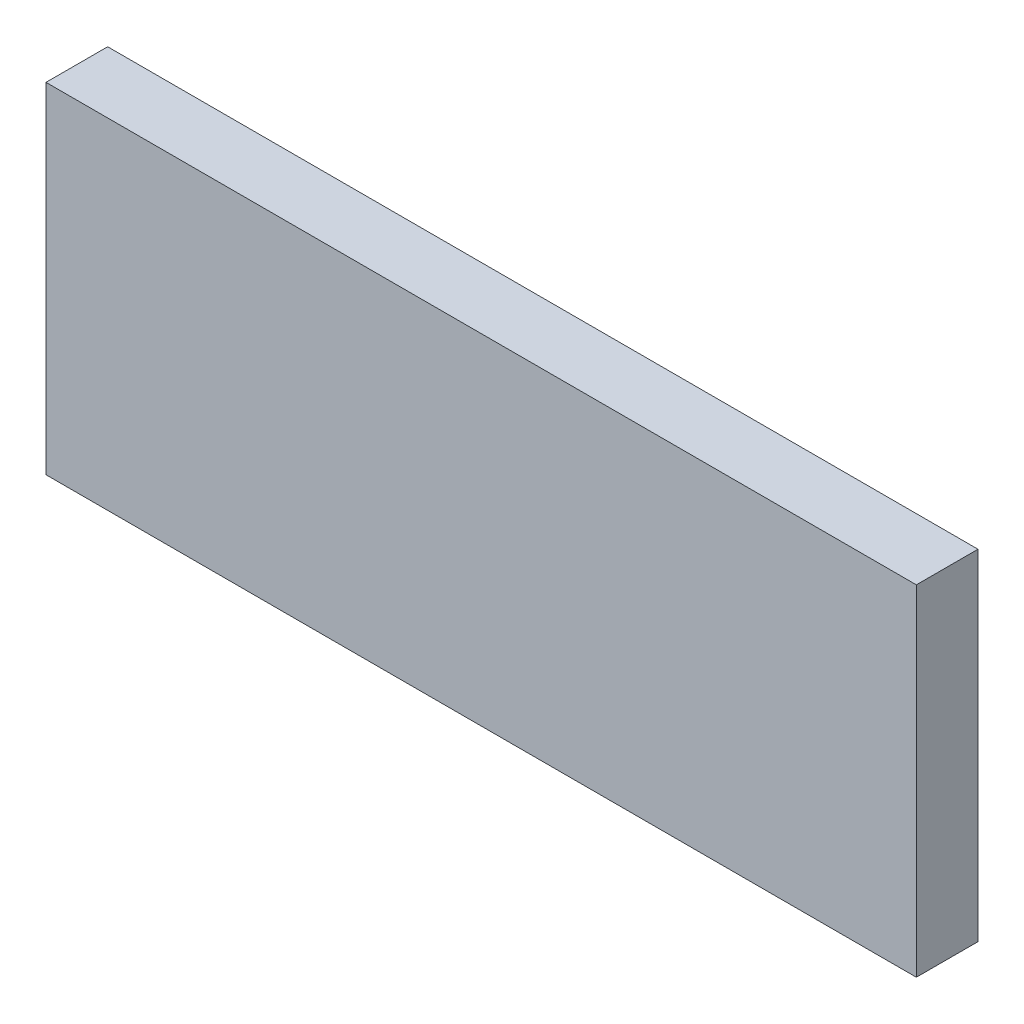
ISO-10303-21;
HEADER;
FILE_DESCRIPTION(('STEP AP214'),'2;1');
FILE_NAME('part.step','',(''),(''),'','','');
FILE_SCHEMA(('AUTOMOTIVE_DESIGN { 1 0 10303 214 1 1 1 1 }'));
ENDSEC;
DATA;
#1=APPLICATION_CONTEXT('core data for automotive mechanical design processes');
#2=APPLICATION_PROTOCOL_DEFINITION('international standard','automotive_design',2000,#1);
#3=PRODUCT_CONTEXT('',#1,'mechanical');
#4=PRODUCT('Part','Part','',(#3));
#5=PRODUCT_RELATED_PRODUCT_CATEGORY('part','',(#4));
#6=PRODUCT_DEFINITION_FORMATION('','',#4);
#7=PRODUCT_DEFINITION_CONTEXT('part definition',#1,'design');
#8=PRODUCT_DEFINITION('design','',#6,#7);
#9=PRODUCT_DEFINITION_SHAPE('','',#8);
#10=(LENGTH_UNIT() NAMED_UNIT(*) SI_UNIT(.MILLI.,.METRE.));
#11=(NAMED_UNIT(*) PLANE_ANGLE_UNIT() SI_UNIT($,.RADIAN.));
#12=(NAMED_UNIT(*) SI_UNIT($,.STERADIAN.) SOLID_ANGLE_UNIT());
#13=UNCERTAINTY_MEASURE_WITH_UNIT(LENGTH_MEASURE(1.E-05),#10,'distance_accuracy_value','');
#14=(GEOMETRIC_REPRESENTATION_CONTEXT(3) GLOBAL_UNCERTAINTY_ASSIGNED_CONTEXT((#13)) GLOBAL_UNIT_ASSIGNED_CONTEXT((#10,
#11,#12)) REPRESENTATION_CONTEXT('',''));
#15=CARTESIAN_POINT('',(0.,0.,0.));
#16=DIRECTION('',(0.,0.,1.));
#17=DIRECTION('',(1.,0.,0.));
#18=AXIS2_PLACEMENT_3D('',#15,#16,#17);
#19=CARTESIAN_POINT('',(44.815,-17.5,6.35));
#20=DIRECTION('',(-1.,0.,0.));
#21=DIRECTION('',(0.,0.,1.));
#22=AXIS2_PLACEMENT_3D('',#19,#20,#21);
#23=PLANE('',#22);
#24=DIRECTION('',(0.,1.,0.));
#25=VECTOR('',#24,1.);
#26=CARTESIAN_POINT('',(44.815,-17.5,0.));
#27=LINE('',#26,#25);
#28=CARTESIAN_POINT('',(44.815,-17.5,0.));
#29=VERTEX_POINT('',#28);
#30=CARTESIAN_POINT('',(44.815,17.5,0.));
#31=VERTEX_POINT('',#30);
#32=EDGE_CURVE('E111',#29,#31,#27,.T.);
#33=ORIENTED_EDGE('',*,*,#32,.T.);
#34=DIRECTION('',(0.,0.,-1.));
#35=VECTOR('',#34,1.);
#36=CARTESIAN_POINT('',(44.815,17.5,6.35));
#37=LINE('',#36,#35);
#38=CARTESIAN_POINT('',(44.815,17.5,6.35));
#39=VERTEX_POINT('',#38);
#40=EDGE_CURVE('E11',#39,#31,#37,.T.);
#41=ORIENTED_EDGE('',*,*,#40,.F.);
#42=DIRECTION('',(0.,1.,0.));
#43=VECTOR('',#42,1.);
#44=CARTESIAN_POINT('',(44.815,-17.5,6.35));
#45=LINE('',#44,#43);
#46=CARTESIAN_POINT('',(44.815,-17.5,6.35));
#47=VERTEX_POINT('',#46);
#48=EDGE_CURVE('E95',#47,#39,#45,.T.);
#49=ORIENTED_EDGE('',*,*,#48,.F.);
#50=DIRECTION('',(0.,0.,-1.));
#51=VECTOR('',#50,1.);
#52=CARTESIAN_POINT('',(44.815,-17.5,6.35));
#53=LINE('',#52,#51);
#54=EDGE_CURVE('E107',#47,#29,#53,.T.);
#55=ORIENTED_EDGE('',*,*,#54,.T.);
#56=EDGE_LOOP('',(#33,#41,#49,#55));
#57=FACE_BOUND('',#56,.T.);
#58=ADVANCED_FACE('F43',(#57),#23,.F.);
#59=CARTESIAN_POINT('',(-44.815,17.5,6.35));
#60=DIRECTION('',(0.,-1.,0.));
#61=DIRECTION('',(0.,0.,-1.));
#62=AXIS2_PLACEMENT_3D('',#59,#60,#61);
#63=PLANE('',#62);
#64=DIRECTION('',(-1.,0.,0.));
#65=VECTOR('',#64,1.);
#66=CARTESIAN_POINT('',(-44.815,17.5,0.));
#67=LINE('',#66,#65);
#68=CARTESIAN_POINT('',(-44.815,17.5,0.));
#69=VERTEX_POINT('',#68);
#70=EDGE_CURVE('E100',#31,#69,#67,.T.);
#71=ORIENTED_EDGE('',*,*,#70,.T.);
#72=DIRECTION('',(0.,0.,-1.));
#73=VECTOR('',#72,1.);
#74=CARTESIAN_POINT('',(-44.815,17.5,6.35));
#75=LINE('',#74,#73);
#76=CARTESIAN_POINT('',(-44.815,17.5,6.35));
#77=VERTEX_POINT('',#76);
#78=EDGE_CURVE('E52',#77,#69,#75,.T.);
#79=ORIENTED_EDGE('',*,*,#78,.F.);
#80=DIRECTION('',(-1.,0.,0.));
#81=VECTOR('',#80,1.);
#82=CARTESIAN_POINT('',(-44.815,17.5,6.35));
#83=LINE('',#82,#81);
#84=EDGE_CURVE('E90',#39,#77,#83,.T.);
#85=ORIENTED_EDGE('',*,*,#84,.F.);
#86=ORIENTED_EDGE('',*,*,#40,.T.);
#87=EDGE_LOOP('',(#71,#79,#85,#86));
#88=FACE_BOUND('',#87,.T.);
#89=ADVANCED_FACE('F99',(#88),#63,.F.);
#90=CARTESIAN_POINT('',(-44.815,-17.5,6.35));
#91=DIRECTION('',(1.,0.,0.));
#92=DIRECTION('',(0.,0.,-1.));
#93=AXIS2_PLACEMENT_3D('',#90,#91,#92);
#94=PLANE('',#93);
#95=DIRECTION('',(0.,-1.,0.));
#96=VECTOR('',#95,1.);
#97=CARTESIAN_POINT('',(-44.815,-17.5,0.));
#98=LINE('',#97,#96);
#99=CARTESIAN_POINT('',(-44.815,-17.5,0.));
#100=VERTEX_POINT('',#99);
#101=EDGE_CURVE('E77',#69,#100,#98,.T.);
#102=ORIENTED_EDGE('',*,*,#101,.T.);
#103=DIRECTION('',(0.,0.,-1.));
#104=VECTOR('',#103,1.);
#105=CARTESIAN_POINT('',(-44.815,-17.5,6.35));
#106=LINE('',#105,#104);
#107=CARTESIAN_POINT('',(-44.815,-17.5,6.35));
#108=VERTEX_POINT('',#107);
#109=EDGE_CURVE('E102',#108,#100,#106,.T.);
#110=ORIENTED_EDGE('',*,*,#109,.F.);
#111=DIRECTION('',(0.,-1.,0.));
#112=VECTOR('',#111,1.);
#113=CARTESIAN_POINT('',(-44.815,-17.5,6.35));
#114=LINE('',#113,#112);
#115=EDGE_CURVE('E93',#77,#108,#114,.T.);
#116=ORIENTED_EDGE('',*,*,#115,.F.);
#117=ORIENTED_EDGE('',*,*,#78,.T.);
#118=EDGE_LOOP('',(#102,#110,#116,#117));
#119=FACE_BOUND('',#118,.T.);
#120=ADVANCED_FACE('F103',(#119),#94,.F.);
#121=CARTESIAN_POINT('',(-44.815,-17.5,6.35));
#122=DIRECTION('',(0.,1.,0.));
#123=DIRECTION('',(0.,0.,1.));
#124=AXIS2_PLACEMENT_3D('',#121,#122,#123);
#125=PLANE('',#124);
#126=DIRECTION('',(1.,0.,0.));
#127=VECTOR('',#126,1.);
#128=CARTESIAN_POINT('',(-44.815,-17.5,0.));
#129=LINE('',#128,#127);
#130=EDGE_CURVE('E83',#100,#29,#129,.T.);
#131=ORIENTED_EDGE('',*,*,#130,.T.);
#132=ORIENTED_EDGE('',*,*,#54,.F.);
#133=DIRECTION('',(1.,0.,0.));
#134=VECTOR('',#133,1.);
#135=CARTESIAN_POINT('',(-44.815,-17.5,6.35));
#136=LINE('',#135,#134);
#137=EDGE_CURVE('E60',#108,#47,#136,.T.);
#138=ORIENTED_EDGE('',*,*,#137,.F.);
#139=ORIENTED_EDGE('',*,*,#109,.T.);
#140=EDGE_LOOP('',(#131,#132,#138,#139));
#141=FACE_BOUND('',#140,.T.);
#142=ADVANCED_FACE('F124',(#141),#125,.F.);
#143=CARTESIAN_POINT('',(0.,0.,6.35));
#144=DIRECTION('',(0.,0.,-1.));
#145=DIRECTION('',(-1.,0.,0.));
#146=AXIS2_PLACEMENT_3D('',#143,#144,#145);
#147=PLANE('',#146);
#148=ORIENTED_EDGE('',*,*,#48,.T.);
#149=ORIENTED_EDGE('',*,*,#84,.T.);
#150=ORIENTED_EDGE('',*,*,#115,.T.);
#151=ORIENTED_EDGE('',*,*,#137,.T.);
#152=EDGE_LOOP('',(#148,#149,#150,#151));
#153=FACE_BOUND('',#152,.T.);
#154=ADVANCED_FACE('F91',(#153),#147,.F.);
#155=CARTESIAN_POINT('',(0.,0.,0.));
#156=DIRECTION('',(0.,0.,-1.));
#157=DIRECTION('',(-1.,0.,0.));
#158=AXIS2_PLACEMENT_3D('',#155,#156,#157);
#159=PLANE('',#158);
#160=ORIENTED_EDGE('',*,*,#32,.F.);
#161=ORIENTED_EDGE('',*,*,#130,.F.);
#162=ORIENTED_EDGE('',*,*,#101,.F.);
#163=ORIENTED_EDGE('',*,*,#70,.F.);
#164=EDGE_LOOP('',(#160,#161,#162,#163));
#165=FACE_BOUND('',#164,.T.);
#166=ADVANCED_FACE('F127',(#165),#159,.T.);
#167=CLOSED_SHELL('',(#58,#89,#120,#142,#154,#166));
#168=MANIFOLD_SOLID_BREP('B2',#167);
#169=ADVANCED_BREP_SHAPE_REPRESENTATION('',(#18,#168),#14);
#170=SHAPE_DEFINITION_REPRESENTATION(#9,#169);
ENDSEC;
END-ISO-10303-21;
